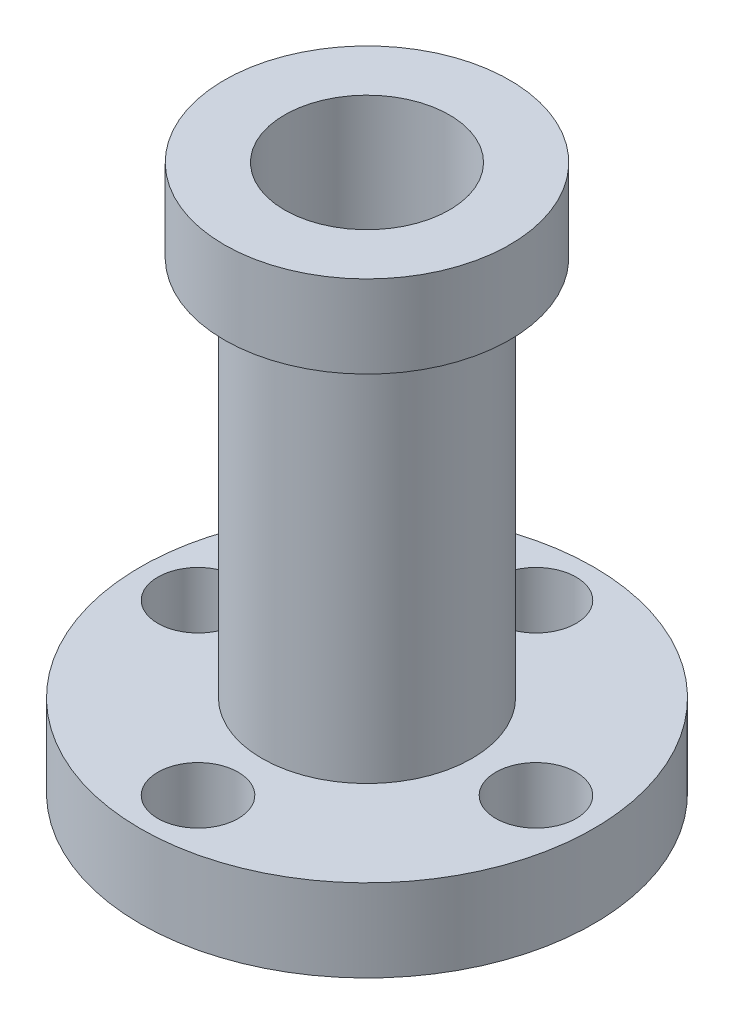
ISO-10303-21;
HEADER;
FILE_DESCRIPTION(('STEP AP214'),'2;1');
FILE_NAME('part.step','',(''),(''),'','','');
FILE_SCHEMA(('AUTOMOTIVE_DESIGN { 1 0 10303 214 1 1 1 1 }'));
ENDSEC;
DATA;
#1=APPLICATION_CONTEXT('core data for automotive mechanical design processes');
#2=APPLICATION_PROTOCOL_DEFINITION('international standard','automotive_design',2000,#1);
#3=PRODUCT_CONTEXT('',#1,'mechanical');
#4=PRODUCT('Part','Part','',(#3));
#5=PRODUCT_RELATED_PRODUCT_CATEGORY('part','',(#4));
#6=PRODUCT_DEFINITION_FORMATION('','',#4);
#7=PRODUCT_DEFINITION_CONTEXT('part definition',#1,'design');
#8=PRODUCT_DEFINITION('design','',#6,#7);
#9=PRODUCT_DEFINITION_SHAPE('','',#8);
#10=(LENGTH_UNIT() NAMED_UNIT(*) SI_UNIT(.MILLI.,.METRE.));
#11=(NAMED_UNIT(*) PLANE_ANGLE_UNIT() SI_UNIT($,.RADIAN.));
#12=(NAMED_UNIT(*) SI_UNIT($,.STERADIAN.) SOLID_ANGLE_UNIT());
#13=UNCERTAINTY_MEASURE_WITH_UNIT(LENGTH_MEASURE(1.E-05),#10,'distance_accuracy_value','');
#14=(GEOMETRIC_REPRESENTATION_CONTEXT(3) GLOBAL_UNCERTAINTY_ASSIGNED_CONTEXT((#13)) GLOBAL_UNIT_ASSIGNED_CONTEXT((#10,
#11,#12)) REPRESENTATION_CONTEXT('',''));
#15=CARTESIAN_POINT('',(0.,0.,0.));
#16=DIRECTION('',(0.,0.,1.));
#17=DIRECTION('',(1.,0.,0.));
#18=AXIS2_PLACEMENT_3D('',#15,#16,#17);
#19=CARTESIAN_POINT('',(0.,4.,0.));
#20=DIRECTION('',(0.,1.,0.));
#21=DIRECTION('',(0.,0.,1.));
#22=AXIS2_PLACEMENT_3D('',#19,#20,#21);
#23=PLANE('',#22);
#24=CARTESIAN_POINT('',(0.,4.,0.));
#25=DIRECTION('',(0.,1.,0.));
#26=DIRECTION('',(0.,0.,1.));
#27=AXIS2_PLACEMENT_3D('',#24,#25,#26);
#28=CIRCLE('',#27,5.1);
#29=CARTESIAN_POINT('',(0.,4.,5.1));
#30=VERTEX_POINT('',#29);
#31=EDGE_CURVE('E68',#30,#30,#28,.T.);
#32=ORIENTED_EDGE('',*,*,#31,.F.);
#33=EDGE_LOOP('',(#32));
#34=FACE_BOUND('',#33,.T.);
#35=CARTESIAN_POINT('',(0.,4.,-8.2));
#36=DIRECTION('',(0.,1.,0.));
#37=DIRECTION('',(0.,0.,1.));
#38=AXIS2_PLACEMENT_3D('',#35,#36,#37);
#39=CIRCLE('',#38,1.95);
#40=CARTESIAN_POINT('',(0.,4.,-6.25));
#41=VERTEX_POINT('',#40);
#42=EDGE_CURVE('E53',#41,#41,#39,.T.);
#43=ORIENTED_EDGE('',*,*,#42,.F.);
#44=EDGE_LOOP('',(#43));
#45=FACE_BOUND('',#44,.T.);
#46=CARTESIAN_POINT('',(-8.2,4.,0.));
#47=DIRECTION('',(0.,1.,0.));
#48=DIRECTION('',(0.,0.,1.));
#49=AXIS2_PLACEMENT_3D('',#46,#47,#48);
#50=CIRCLE('',#49,1.95);
#51=CARTESIAN_POINT('',(-8.2,4.,1.95));
#52=VERTEX_POINT('',#51);
#53=EDGE_CURVE('E42',#52,#52,#50,.T.);
#54=ORIENTED_EDGE('',*,*,#53,.F.);
#55=EDGE_LOOP('',(#54));
#56=FACE_BOUND('',#55,.T.);
#57=CARTESIAN_POINT('',(0.,4.,0.));
#58=DIRECTION('',(0.,1.,0.));
#59=DIRECTION('',(0.,0.,1.));
#60=AXIS2_PLACEMENT_3D('',#57,#58,#59);
#61=CIRCLE('',#60,11.);
#62=CARTESIAN_POINT('',(0.,4.,11.));
#63=VERTEX_POINT('',#62);
#64=EDGE_CURVE('E10',#63,#63,#61,.T.);
#65=ORIENTED_EDGE('',*,*,#64,.T.);
#66=EDGE_LOOP('',(#65));
#67=FACE_BOUND('',#66,.T.);
#68=CARTESIAN_POINT('',(8.2,4.,0.));
#69=DIRECTION('',(0.,1.,0.));
#70=DIRECTION('',(0.,0.,-1.));
#71=AXIS2_PLACEMENT_3D('',#68,#69,#70);
#72=CIRCLE('',#71,1.95);
#73=CARTESIAN_POINT('',(8.2,4.,-1.95));
#74=VERTEX_POINT('',#73);
#75=EDGE_CURVE('E47',#74,#74,#72,.T.);
#76=ORIENTED_EDGE('',*,*,#75,.F.);
#77=EDGE_LOOP('',(#76));
#78=FACE_BOUND('',#77,.T.);
#79=CARTESIAN_POINT('',(0.,4.,8.2));
#80=DIRECTION('',(0.,1.,0.));
#81=DIRECTION('',(0.,0.,-1.));
#82=AXIS2_PLACEMENT_3D('',#79,#80,#81);
#83=CIRCLE('',#82,1.95);
#84=CARTESIAN_POINT('',(0.,4.,6.25));
#85=VERTEX_POINT('',#84);
#86=EDGE_CURVE('E59',#85,#85,#83,.T.);
#87=ORIENTED_EDGE('',*,*,#86,.F.);
#88=EDGE_LOOP('',(#87));
#89=FACE_BOUND('',#88,.T.);
#90=ADVANCED_FACE('F31',(#34,#45,#56,#67,#78,#89),#23,.T.);
#91=CARTESIAN_POINT('',(0.,0.,0.));
#92=DIRECTION('',(0.,1.,0.));
#93=DIRECTION('',(0.,0.,1.));
#94=AXIS2_PLACEMENT_3D('',#91,#92,#93);
#95=PLANE('',#94);
#96=CARTESIAN_POINT('',(0.,0.,0.));
#97=DIRECTION('',(0.,1.,0.));
#98=DIRECTION('',(0.,0.,1.));
#99=AXIS2_PLACEMENT_3D('',#96,#97,#98);
#100=CIRCLE('',#99,4.);
#101=CARTESIAN_POINT('',(0.,0.,4.));
#102=VERTEX_POINT('',#101);
#103=EDGE_CURVE('E77',#102,#102,#100,.T.);
#104=ORIENTED_EDGE('',*,*,#103,.T.);
#105=EDGE_LOOP('',(#104));
#106=FACE_BOUND('',#105,.T.);
#107=CARTESIAN_POINT('',(0.,0.,0.));
#108=DIRECTION('',(0.,1.,0.));
#109=DIRECTION('',(0.,0.,1.));
#110=AXIS2_PLACEMENT_3D('',#107,#108,#109);
#111=CIRCLE('',#110,11.);
#112=CARTESIAN_POINT('',(0.,0.,11.));
#113=VERTEX_POINT('',#112);
#114=EDGE_CURVE('E35',#113,#113,#111,.T.);
#115=ORIENTED_EDGE('',*,*,#114,.F.);
#116=EDGE_LOOP('',(#115));
#117=FACE_BOUND('',#116,.T.);
#118=CARTESIAN_POINT('',(-8.2,0.,0.));
#119=DIRECTION('',(0.,1.,0.));
#120=DIRECTION('',(0.,0.,1.));
#121=AXIS2_PLACEMENT_3D('',#118,#119,#120);
#122=CIRCLE('',#121,1.95);
#123=CARTESIAN_POINT('',(-8.2,0.,1.95));
#124=VERTEX_POINT('',#123);
#125=EDGE_CURVE('E44',#124,#124,#122,.T.);
#126=ORIENTED_EDGE('',*,*,#125,.T.);
#127=EDGE_LOOP('',(#126));
#128=FACE_BOUND('',#127,.T.);
#129=CARTESIAN_POINT('',(8.2,0.,0.));
#130=DIRECTION('',(0.,1.,0.));
#131=DIRECTION('',(0.,0.,-1.));
#132=AXIS2_PLACEMENT_3D('',#129,#130,#131);
#133=CIRCLE('',#132,1.95);
#134=CARTESIAN_POINT('',(8.2,0.,-1.95));
#135=VERTEX_POINT('',#134);
#136=EDGE_CURVE('E50',#135,#135,#133,.T.);
#137=ORIENTED_EDGE('',*,*,#136,.T.);
#138=EDGE_LOOP('',(#137));
#139=FACE_BOUND('',#138,.T.);
#140=CARTESIAN_POINT('',(0.,0.,-8.2));
#141=DIRECTION('',(0.,1.,0.));
#142=DIRECTION('',(0.,0.,1.));
#143=AXIS2_PLACEMENT_3D('',#140,#141,#142);
#144=CIRCLE('',#143,1.95);
#145=CARTESIAN_POINT('',(0.,0.,-6.25));
#146=VERTEX_POINT('',#145);
#147=EDGE_CURVE('E56',#146,#146,#144,.T.);
#148=ORIENTED_EDGE('',*,*,#147,.T.);
#149=EDGE_LOOP('',(#148));
#150=FACE_BOUND('',#149,.T.);
#151=CARTESIAN_POINT('',(0.,0.,8.2));
#152=DIRECTION('',(0.,1.,0.));
#153=DIRECTION('',(0.,0.,-1.));
#154=AXIS2_PLACEMENT_3D('',#151,#152,#153);
#155=CIRCLE('',#154,1.95);
#156=CARTESIAN_POINT('',(0.,0.,6.25));
#157=VERTEX_POINT('',#156);
#158=EDGE_CURVE('E62',#157,#157,#155,.T.);
#159=ORIENTED_EDGE('',*,*,#158,.T.);
#160=EDGE_LOOP('',(#159));
#161=FACE_BOUND('',#160,.T.);
#162=ADVANCED_FACE('F86',(#106,#117,#128,#139,#150,#161),#95,.F.);
#163=CARTESIAN_POINT('',(0.,4.,0.));
#164=DIRECTION('',(0.,-1.,0.));
#165=DIRECTION('',(0.,0.,-1.));
#166=AXIS2_PLACEMENT_3D('',#163,#164,#165);
#167=CYLINDRICAL_SURFACE('',#166,11.);
#168=ORIENTED_EDGE('',*,*,#64,.F.);
#169=EDGE_LOOP('',(#168));
#170=FACE_BOUND('',#169,.T.);
#171=ORIENTED_EDGE('',*,*,#114,.T.);
#172=EDGE_LOOP('',(#171));
#173=FACE_BOUND('',#172,.T.);
#174=ADVANCED_FACE('F33',(#170,#173),#167,.T.);
#175=CARTESIAN_POINT('',(-8.2,4.,0.));
#176=DIRECTION('',(0.,-1.,0.));
#177=DIRECTION('',(0.,0.,-1.));
#178=AXIS2_PLACEMENT_3D('',#175,#176,#177);
#179=CYLINDRICAL_SURFACE('',#178,1.95);
#180=ORIENTED_EDGE('',*,*,#53,.T.);
#181=EDGE_LOOP('',(#180));
#182=FACE_BOUND('',#181,.T.);
#183=ORIENTED_EDGE('',*,*,#125,.F.);
#184=EDGE_LOOP('',(#183));
#185=FACE_BOUND('',#184,.T.);
#186=ADVANCED_FACE('F123',(#182,#185),#179,.F.);
#187=CARTESIAN_POINT('',(8.2,4.,0.));
#188=DIRECTION('',(0.,-1.,0.));
#189=DIRECTION('',(0.,0.,-1.));
#190=AXIS2_PLACEMENT_3D('',#187,#188,#189);
#191=CYLINDRICAL_SURFACE('',#190,1.95);
#192=ORIENTED_EDGE('',*,*,#75,.T.);
#193=EDGE_LOOP('',(#192));
#194=FACE_BOUND('',#193,.T.);
#195=ORIENTED_EDGE('',*,*,#136,.F.);
#196=EDGE_LOOP('',(#195));
#197=FACE_BOUND('',#196,.T.);
#198=ADVANCED_FACE('F126',(#194,#197),#191,.F.);
#199=CARTESIAN_POINT('',(0.,4.,-8.2));
#200=DIRECTION('',(0.,-1.,0.));
#201=DIRECTION('',(0.,0.,-1.));
#202=AXIS2_PLACEMENT_3D('',#199,#200,#201);
#203=CYLINDRICAL_SURFACE('',#202,1.95);
#204=ORIENTED_EDGE('',*,*,#42,.T.);
#205=EDGE_LOOP('',(#204));
#206=FACE_BOUND('',#205,.T.);
#207=ORIENTED_EDGE('',*,*,#147,.F.);
#208=EDGE_LOOP('',(#207));
#209=FACE_BOUND('',#208,.T.);
#210=ADVANCED_FACE('F130',(#206,#209),#203,.F.);
#211=CARTESIAN_POINT('',(0.,4.,8.2));
#212=DIRECTION('',(0.,-1.,0.));
#213=DIRECTION('',(0.,0.,-1.));
#214=AXIS2_PLACEMENT_3D('',#211,#212,#213);
#215=CYLINDRICAL_SURFACE('',#214,1.95);
#216=ORIENTED_EDGE('',*,*,#86,.T.);
#217=EDGE_LOOP('',(#216));
#218=FACE_BOUND('',#217,.T.);
#219=ORIENTED_EDGE('',*,*,#158,.F.);
#220=EDGE_LOOP('',(#219));
#221=FACE_BOUND('',#220,.T.);
#222=ADVANCED_FACE('F134',(#218,#221),#215,.F.);
#223=CARTESIAN_POINT('',(0.,22.5,0.));
#224=DIRECTION('',(0.,-1.,0.));
#225=DIRECTION('',(0.,0.,-1.));
#226=AXIS2_PLACEMENT_3D('',#223,#224,#225);
#227=CYLINDRICAL_SURFACE('',#226,5.1);
#228=CARTESIAN_POINT('',(0.,22.5,0.));
#229=DIRECTION('',(0.,1.,0.));
#230=DIRECTION('',(0.,0.,1.));
#231=AXIS2_PLACEMENT_3D('',#228,#229,#230);
#232=CIRCLE('',#231,5.1);
#233=CARTESIAN_POINT('',(0.,22.5,5.1));
#234=VERTEX_POINT('',#233);
#235=EDGE_CURVE('E65',#234,#234,#232,.T.);
#236=ORIENTED_EDGE('',*,*,#235,.F.);
#237=EDGE_LOOP('',(#236));
#238=FACE_BOUND('',#237,.T.);
#239=ORIENTED_EDGE('',*,*,#31,.T.);
#240=EDGE_LOOP('',(#239));
#241=FACE_BOUND('',#240,.T.);
#242=ADVANCED_FACE('F105',(#238,#241),#227,.T.);
#243=CARTESIAN_POINT('',(0.,26.5,0.));
#244=DIRECTION('',(0.,-1.,0.));
#245=DIRECTION('',(0.,0.,-1.));
#246=AXIS2_PLACEMENT_3D('',#243,#244,#245);
#247=CYLINDRICAL_SURFACE('',#246,6.925);
#248=CARTESIAN_POINT('',(0.,26.5,0.));
#249=DIRECTION('',(0.,1.,0.));
#250=DIRECTION('',(0.,0.,1.));
#251=AXIS2_PLACEMENT_3D('',#248,#249,#250);
#252=CIRCLE('',#251,6.925);
#253=CARTESIAN_POINT('',(0.,26.5,6.925));
#254=VERTEX_POINT('',#253);
#255=EDGE_CURVE('E71',#254,#254,#252,.T.);
#256=ORIENTED_EDGE('',*,*,#255,.F.);
#257=EDGE_LOOP('',(#256));
#258=FACE_BOUND('',#257,.T.);
#259=CARTESIAN_POINT('',(0.,22.5,0.));
#260=DIRECTION('',(0.,1.,0.));
#261=DIRECTION('',(0.,0.,1.));
#262=AXIS2_PLACEMENT_3D('',#259,#260,#261);
#263=CIRCLE('',#262,6.925);
#264=CARTESIAN_POINT('',(0.,22.5,6.925));
#265=VERTEX_POINT('',#264);
#266=EDGE_CURVE('E74',#265,#265,#263,.T.);
#267=ORIENTED_EDGE('',*,*,#266,.T.);
#268=EDGE_LOOP('',(#267));
#269=FACE_BOUND('',#268,.T.);
#270=ADVANCED_FACE('F99',(#258,#269),#247,.T.);
#271=CARTESIAN_POINT('',(0.,26.5,0.));
#272=DIRECTION('',(0.,1.,0.));
#273=DIRECTION('',(0.,0.,1.));
#274=AXIS2_PLACEMENT_3D('',#271,#272,#273);
#275=PLANE('',#274);
#276=CARTESIAN_POINT('',(0.,26.5,0.));
#277=DIRECTION('',(0.,1.,0.));
#278=DIRECTION('',(0.,0.,1.));
#279=AXIS2_PLACEMENT_3D('',#276,#277,#278);
#280=CIRCLE('',#279,4.);
#281=CARTESIAN_POINT('',(0.,26.5,4.));
#282=VERTEX_POINT('',#281);
#283=EDGE_CURVE('E80',#282,#282,#280,.T.);
#284=ORIENTED_EDGE('',*,*,#283,.F.);
#285=EDGE_LOOP('',(#284));
#286=FACE_BOUND('',#285,.T.);
#287=ORIENTED_EDGE('',*,*,#255,.T.);
#288=EDGE_LOOP('',(#287));
#289=FACE_BOUND('',#288,.T.);
#290=ADVANCED_FACE('F96',(#286,#289),#275,.T.);
#291=CARTESIAN_POINT('',(0.,22.5,0.));
#292=DIRECTION('',(0.,1.,0.));
#293=DIRECTION('',(0.,0.,1.));
#294=AXIS2_PLACEMENT_3D('',#291,#292,#293);
#295=PLANE('',#294);
#296=ORIENTED_EDGE('',*,*,#235,.T.);
#297=EDGE_LOOP('',(#296));
#298=FACE_BOUND('',#297,.T.);
#299=ORIENTED_EDGE('',*,*,#266,.F.);
#300=EDGE_LOOP('',(#299));
#301=FACE_BOUND('',#300,.T.);
#302=ADVANCED_FACE('F92',(#298,#301),#295,.F.);
#303=CARTESIAN_POINT('',(0.,0.,0.));
#304=DIRECTION('',(0.,1.,0.));
#305=DIRECTION('',(0.,0.,1.));
#306=AXIS2_PLACEMENT_3D('',#303,#304,#305);
#307=CYLINDRICAL_SURFACE('',#306,4.);
#308=ORIENTED_EDGE('',*,*,#103,.F.);
#309=EDGE_LOOP('',(#308));
#310=FACE_BOUND('',#309,.T.);
#311=ORIENTED_EDGE('',*,*,#283,.T.);
#312=EDGE_LOOP('',(#311));
#313=FACE_BOUND('',#312,.T.);
#314=ADVANCED_FACE('F89',(#310,#313),#307,.F.);
#315=CLOSED_SHELL('',(#90,#162,#174,#186,#198,#210,#222,#242,#270,#290,#302,#314));
#316=MANIFOLD_SOLID_BREP('B2',#315);
#317=ADVANCED_BREP_SHAPE_REPRESENTATION('',(#18,#316),#14);
#318=SHAPE_DEFINITION_REPRESENTATION(#9,#317);
ENDSEC;
END-ISO-10303-21;
